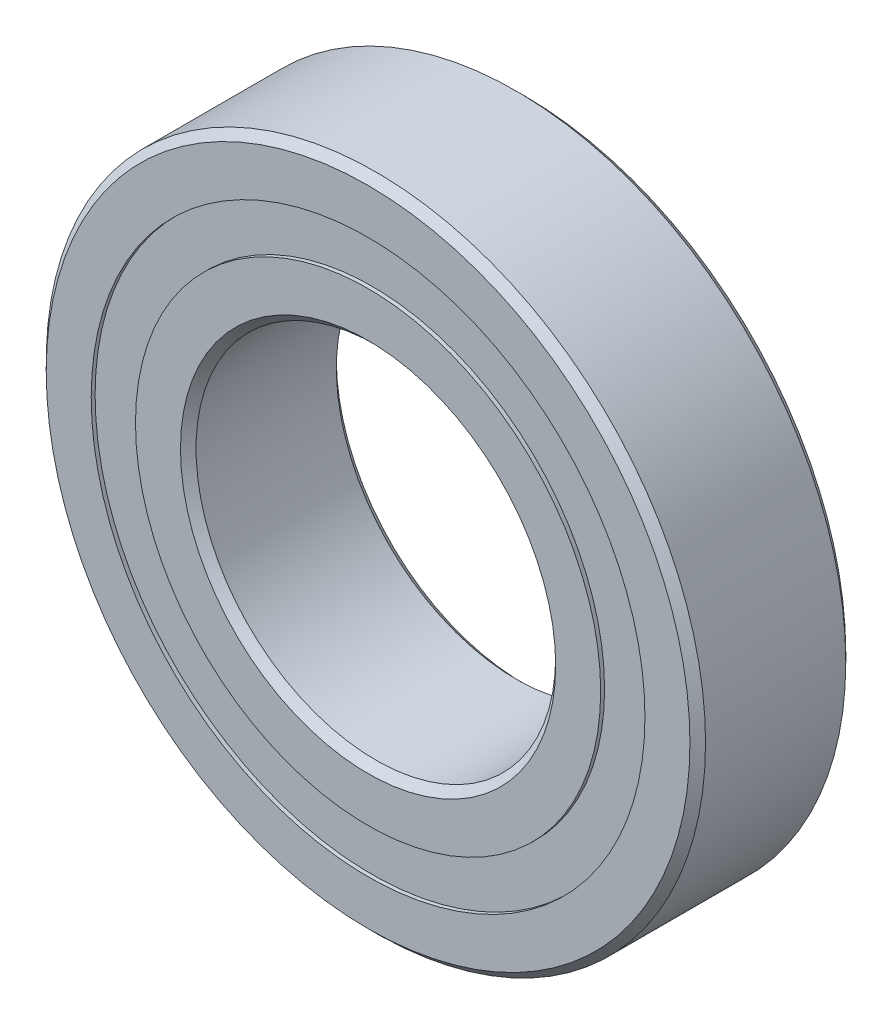
ISO-10303-21;
HEADER;
FILE_DESCRIPTION(('STEP AP214'),'2;1');
FILE_NAME('part.step','',(''),(''),'','','');
FILE_SCHEMA(('AUTOMOTIVE_DESIGN { 1 0 10303 214 1 1 1 1 }'));
ENDSEC;
DATA;
#1=APPLICATION_CONTEXT('core data for automotive mechanical design processes');
#2=APPLICATION_PROTOCOL_DEFINITION('international standard','automotive_design',2000,#1);
#3=PRODUCT_CONTEXT('',#1,'mechanical');
#4=PRODUCT('Part','Part','',(#3));
#5=PRODUCT_RELATED_PRODUCT_CATEGORY('part','',(#4));
#6=PRODUCT_DEFINITION_FORMATION('','',#4);
#7=PRODUCT_DEFINITION_CONTEXT('part definition',#1,'design');
#8=PRODUCT_DEFINITION('design','',#6,#7);
#9=PRODUCT_DEFINITION_SHAPE('','',#8);
#10=(LENGTH_UNIT() NAMED_UNIT(*) SI_UNIT(.MILLI.,.METRE.));
#11=(NAMED_UNIT(*) PLANE_ANGLE_UNIT() SI_UNIT($,.RADIAN.));
#12=(NAMED_UNIT(*) SI_UNIT($,.STERADIAN.) SOLID_ANGLE_UNIT());
#13=UNCERTAINTY_MEASURE_WITH_UNIT(LENGTH_MEASURE(1.E-05),#10,'distance_accuracy_value','');
#14=(GEOMETRIC_REPRESENTATION_CONTEXT(3) GLOBAL_UNCERTAINTY_ASSIGNED_CONTEXT((#13)) GLOBAL_UNIT_ASSIGNED_CONTEXT((#10,
#11,#12)) REPRESENTATION_CONTEXT('',''));
#15=CARTESIAN_POINT('',(0.,0.,0.));
#16=DIRECTION('',(0.,0.,1.));
#17=DIRECTION('',(1.,0.,0.));
#18=AXIS2_PLACEMENT_3D('',#15,#16,#17);
#19=CARTESIAN_POINT('',(0.,23.0961538461538,-6.175));
#20=DIRECTION('',(0.,0.,1.));
#21=DIRECTION('',(1.,0.,0.));
#22=AXIS2_PLACEMENT_3D('',#19,#20,#21);
#23=PLANE('',#22);
#24=CARTESIAN_POINT('',(0.,0.,-6.175));
#25=DIRECTION('',(0.,0.,1.));
#26=DIRECTION('',(1.,0.,0.));
#27=AXIS2_PLACEMENT_3D('',#24,#25,#26);
#28=CIRCLE('',#27,23.0961538461538);
#29=CARTESIAN_POINT('',(23.0961538461538,0.,-6.175));
#30=VERTEX_POINT('',#29);
#31=EDGE_CURVE('E57',#30,#30,#28,.T.);
#32=ORIENTED_EDGE('',*,*,#31,.F.);
#33=EDGE_LOOP('',(#32));
#34=FACE_BOUND('',#33,.T.);
#35=CARTESIAN_POINT('',(0.,0.,-6.175));
#36=DIRECTION('',(0.,0.,1.));
#37=DIRECTION('',(1.,0.,0.));
#38=AXIS2_PLACEMENT_3D('',#35,#36,#37);
#39=CIRCLE('',#38,19.4038461538462);
#40=CARTESIAN_POINT('',(19.4038461538462,0.,-6.175));
#41=VERTEX_POINT('',#40);
#42=EDGE_CURVE('E11',#41,#41,#39,.T.);
#43=ORIENTED_EDGE('',*,*,#42,.T.);
#44=EDGE_LOOP('',(#43));
#45=FACE_BOUND('',#44,.T.);
#46=ADVANCED_FACE('F43',(#34,#45),#23,.F.);
#47=CARTESIAN_POINT('',(0.,0.,6.5));
#48=DIRECTION('',(0.,0.,1.));
#49=DIRECTION('',(1.,0.,0.));
#50=AXIS2_PLACEMENT_3D('',#47,#48,#49);
#51=CYLINDRICAL_SURFACE('',#50,19.4038461538462);
#52=ORIENTED_EDGE('',*,*,#42,.F.);
#53=EDGE_LOOP('',(#52));
#54=FACE_BOUND('',#53,.T.);
#55=CARTESIAN_POINT('',(0.,0.,-3.42840531968061));
#56=DIRECTION('',(0.,0.,1.));
#57=DIRECTION('',(1.,0.,0.));
#58=AXIS2_PLACEMENT_3D('',#55,#56,#57);
#59=CIRCLE('',#58,19.4038461538462);
#60=CARTESIAN_POINT('',(19.4038461538462,0.,-3.42840531968061));
#61=VERTEX_POINT('',#60);
#62=EDGE_CURVE('E49',#61,#61,#59,.T.);
#63=ORIENTED_EDGE('',*,*,#62,.T.);
#64=EDGE_LOOP('',(#63));
#65=FACE_BOUND('',#64,.T.);
#66=ADVANCED_FACE('F66',(#54,#65),#51,.F.);
#67=CARTESIAN_POINT('',(0.,23.0961538461538,-3.42840531968061));
#68=DIRECTION('',(0.,0.,-1.));
#69=DIRECTION('',(-1.,0.,0.));
#70=AXIS2_PLACEMENT_3D('',#67,#68,#69);
#71=PLANE('',#70);
#72=ORIENTED_EDGE('',*,*,#62,.F.);
#73=EDGE_LOOP('',(#72));
#74=FACE_BOUND('',#73,.T.);
#75=CARTESIAN_POINT('',(0.,0.,-3.42840531968061));
#76=DIRECTION('',(0.,0.,1.));
#77=DIRECTION('',(1.,0.,0.));
#78=AXIS2_PLACEMENT_3D('',#75,#76,#77);
#79=CIRCLE('',#78,23.0961538461538);
#80=CARTESIAN_POINT('',(23.0961538461538,0.,-3.42840531968061));
#81=VERTEX_POINT('',#80);
#82=EDGE_CURVE('E53',#81,#81,#79,.T.);
#83=ORIENTED_EDGE('',*,*,#82,.T.);
#84=EDGE_LOOP('',(#83));
#85=FACE_BOUND('',#84,.T.);
#86=ADVANCED_FACE('F70',(#74,#85),#71,.F.);
#87=CARTESIAN_POINT('',(0.,0.,6.5));
#88=DIRECTION('',(0.,0.,1.));
#89=DIRECTION('',(1.,0.,0.));
#90=AXIS2_PLACEMENT_3D('',#87,#88,#89);
#91=CYLINDRICAL_SURFACE('',#90,23.0961538461538);
#92=ORIENTED_EDGE('',*,*,#82,.F.);
#93=EDGE_LOOP('',(#92));
#94=FACE_BOUND('',#93,.T.);
#95=ORIENTED_EDGE('',*,*,#31,.T.);
#96=EDGE_LOOP('',(#95));
#97=FACE_BOUND('',#96,.T.);
#98=ADVANCED_FACE('F63',(#94,#97),#91,.T.);
#99=CLOSED_SHELL('',(#46,#66,#86,#98));
#100=MANIFOLD_SOLID_BREP('B2',#99);
#101=CARTESIAN_POINT('',(0.,23.0961538461538,6.175));
#102=DIRECTION('',(0.,0.,-1.));
#103=DIRECTION('',(-1.,0.,0.));
#104=AXIS2_PLACEMENT_3D('',#101,#102,#103);
#105=PLANE('',#104);
#106=CARTESIAN_POINT('',(0.,0.,6.175));
#107=DIRECTION('',(0.,0.,1.));
#108=DIRECTION('',(1.,0.,0.));
#109=AXIS2_PLACEMENT_3D('',#106,#107,#108);
#110=CIRCLE('',#109,19.4038461538462);
#111=CARTESIAN_POINT('',(19.4038461538462,0.,6.175));
#112=VERTEX_POINT('',#111);
#113=EDGE_CURVE('E42',#112,#112,#110,.T.);
#114=ORIENTED_EDGE('',*,*,#113,.F.);
#115=EDGE_LOOP('',(#114));
#116=FACE_BOUND('',#115,.T.);
#117=CARTESIAN_POINT('',(0.,0.,6.175));
#118=DIRECTION('',(0.,0.,1.));
#119=DIRECTION('',(1.,0.,0.));
#120=AXIS2_PLACEMENT_3D('',#117,#118,#119);
#121=CIRCLE('',#120,23.0961538461538);
#122=CARTESIAN_POINT('',(23.0961538461538,0.,6.175));
#123=VERTEX_POINT('',#122);
#124=EDGE_CURVE('E124',#123,#123,#121,.T.);
#125=ORIENTED_EDGE('',*,*,#124,.T.);
#126=EDGE_LOOP('',(#125));
#127=FACE_BOUND('',#126,.T.);
#128=ADVANCED_FACE('F110',(#116,#127),#105,.F.);
#129=CARTESIAN_POINT('',(0.,0.,6.5));
#130=DIRECTION('',(0.,0.,1.));
#131=DIRECTION('',(1.,0.,0.));
#132=AXIS2_PLACEMENT_3D('',#129,#130,#131);
#133=CYLINDRICAL_SURFACE('',#132,19.4038461538462);
#134=CARTESIAN_POINT('',(0.,0.,3.42840531968061));
#135=DIRECTION('',(0.,0.,1.));
#136=DIRECTION('',(1.,0.,0.));
#137=AXIS2_PLACEMENT_3D('',#134,#135,#136);
#138=CIRCLE('',#137,19.4038461538462);
#139=CARTESIAN_POINT('',(19.4038461538462,0.,3.42840531968061));
#140=VERTEX_POINT('',#139);
#141=EDGE_CURVE('E116',#140,#140,#138,.T.);
#142=ORIENTED_EDGE('',*,*,#141,.F.);
#143=EDGE_LOOP('',(#142));
#144=FACE_BOUND('',#143,.T.);
#145=ORIENTED_EDGE('',*,*,#113,.T.);
#146=EDGE_LOOP('',(#145));
#147=FACE_BOUND('',#146,.T.);
#148=ADVANCED_FACE('F139',(#144,#147),#133,.F.);
#149=CARTESIAN_POINT('',(0.,23.0961538461538,3.42840531968061));
#150=DIRECTION('',(0.,0.,1.));
#151=DIRECTION('',(1.,0.,0.));
#152=AXIS2_PLACEMENT_3D('',#149,#150,#151);
#153=PLANE('',#152);
#154=CARTESIAN_POINT('',(0.,0.,3.42840531968061));
#155=DIRECTION('',(0.,0.,1.));
#156=DIRECTION('',(1.,0.,0.));
#157=AXIS2_PLACEMENT_3D('',#154,#155,#156);
#158=CIRCLE('',#157,23.0961538461538);
#159=CARTESIAN_POINT('',(23.0961538461538,0.,3.42840531968061));
#160=VERTEX_POINT('',#159);
#161=EDGE_CURVE('E120',#160,#160,#158,.T.);
#162=ORIENTED_EDGE('',*,*,#161,.F.);
#163=EDGE_LOOP('',(#162));
#164=FACE_BOUND('',#163,.T.);
#165=ORIENTED_EDGE('',*,*,#141,.T.);
#166=EDGE_LOOP('',(#165));
#167=FACE_BOUND('',#166,.T.);
#168=ADVANCED_FACE('F134',(#164,#167),#153,.F.);
#169=CARTESIAN_POINT('',(0.,0.,6.5));
#170=DIRECTION('',(0.,0.,1.));
#171=DIRECTION('',(1.,0.,0.));
#172=AXIS2_PLACEMENT_3D('',#169,#170,#171);
#173=CYLINDRICAL_SURFACE('',#172,23.0961538461538);
#174=ORIENTED_EDGE('',*,*,#124,.F.);
#175=EDGE_LOOP('',(#174));
#176=FACE_BOUND('',#175,.T.);
#177=ORIENTED_EDGE('',*,*,#161,.T.);
#178=EDGE_LOOP('',(#177));
#179=FACE_BOUND('',#178,.T.);
#180=ADVANCED_FACE('F131',(#176,#179),#173,.T.);
#181=CLOSED_SHELL('',(#128,#148,#168,#180));
#182=MANIFOLD_SOLID_BREP('B6',#181);
#183=CARTESIAN_POINT('',(-9.22002945624786,19.1455884429265,0.));
#184=DIRECTION('',(0.,0.,1.));
#185=DIRECTION('',(-0.433883739117546,0.900968867902425,0.));
#186=AXIS2_PLACEMENT_3D('',#183,#184,#185);
#187=SPHERICAL_SURFACE('',#186,3.42840531968061);
#188=CARTESIAN_POINT('',(-9.22002945624786,19.1455884429265,3.42840531968061));
#189=VERTEX_POINT('',#188);
#190=VERTEX_LOOP('',#189);
#191=FACE_BOUND('',#190,.T.);
#192=ADVANCED_FACE('F177',(#191),#187,.T.);
#193=CLOSED_SHELL('',(#192));
#194=MANIFOLD_SOLID_BREP('B37',#193);
#195=CARTESIAN_POINT('',(-16.6139190024455,13.2491582894983,0.));
#196=DIRECTION('',(0.,0.,1.));
#197=DIRECTION('',(-0.781831482468022,0.623489801858743,0.));
#198=AXIS2_PLACEMENT_3D('',#195,#196,#197);
#199=SPHERICAL_SURFACE('',#198,3.42840531968061);
#200=CARTESIAN_POINT('',(-16.6139190024455,13.2491582894983,3.42840531968061));
#201=VERTEX_POINT('',#200);
#202=VERTEX_LOOP('',#201);
#203=FACE_BOUND('',#202,.T.);
#204=ADVANCED_FACE('F197',(#203),#199,.T.);
#205=CLOSED_SHELL('',(#204));
#206=MANIFOLD_SOLID_BREP('B106',#205);
#207=CARTESIAN_POINT('',(-20.7172181338637,4.7285698465719,0.));
#208=DIRECTION('',(0.,0.,1.));
#209=DIRECTION('',(-0.974927912181821,0.222520933956325,0.));
#210=AXIS2_PLACEMENT_3D('',#207,#208,#209);
#211=SPHERICAL_SURFACE('',#210,3.42840531968061);
#212=CARTESIAN_POINT('',(-20.7172181338637,4.7285698465719,3.42840531968061));
#213=VERTEX_POINT('',#212);
#214=VERTEX_LOOP('',#213);
#215=FACE_BOUND('',#214,.T.);
#216=ADVANCED_FACE('F217',(#215),#211,.T.);
#217=CLOSED_SHELL('',(#216));
#218=MANIFOLD_SOLID_BREP('B173',#217);
#219=CARTESIAN_POINT('',(-20.7172181338638,-4.72856984657148,0.));
#220=DIRECTION('',(0.,0.,1.));
#221=DIRECTION('',(-0.974927912181826,-0.222520933956305,0.));
#222=AXIS2_PLACEMENT_3D('',#219,#220,#221);
#223=SPHERICAL_SURFACE('',#222,3.42840531968061);
#224=CARTESIAN_POINT('',(-20.7172181338638,-4.72856984657148,3.42840531968061));
#225=VERTEX_POINT('',#224);
#226=VERTEX_LOOP('',#225);
#227=FACE_BOUND('',#226,.T.);
#228=ADVANCED_FACE('F237',(#227),#223,.T.);
#229=CLOSED_SHELL('',(#228));
#230=MANIFOLD_SOLID_BREP('B193',#229);
#231=CARTESIAN_POINT('',(-16.6139190024457,-13.2491582894979,0.));
#232=DIRECTION('',(0.,0.,1.));
#233=DIRECTION('',(-0.781831482468035,-0.623489801858727,0.));
#234=AXIS2_PLACEMENT_3D('',#231,#232,#233);
#235=SPHERICAL_SURFACE('',#234,3.42840531968061);
#236=CARTESIAN_POINT('',(-16.6139190024457,-13.2491582894979,3.42840531968061));
#237=VERTEX_POINT('',#236);
#238=VERTEX_LOOP('',#237);
#239=FACE_BOUND('',#238,.T.);
#240=ADVANCED_FACE('F257',(#239),#235,.T.);
#241=CLOSED_SHELL('',(#240));
#242=MANIFOLD_SOLID_BREP('B213',#241);
#243=CARTESIAN_POINT('',(-9.22002945624826,-19.1455884429263,0.));
#244=DIRECTION('',(0.,0.,1.));
#245=DIRECTION('',(-0.433883739117565,-0.900968867902416,0.));
#246=AXIS2_PLACEMENT_3D('',#243,#244,#245);
#247=SPHERICAL_SURFACE('',#246,3.42840531968061);
#248=CARTESIAN_POINT('',(-9.22002945624826,-19.1455884429263,3.42840531968061));
#249=VERTEX_POINT('',#248);
#250=VERTEX_LOOP('',#249);
#251=FACE_BOUND('',#250,.T.);
#252=ADVANCED_FACE('F277',(#251),#247,.T.);
#253=CLOSED_SHELL('',(#252));
#254=MANIFOLD_SOLID_BREP('B233',#253);
#255=CARTESIAN_POINT('',(-1.48387956900833E-13,-21.25,0.));
#256=DIRECTION('',(0.,0.,1.));
#257=DIRECTION('',(0.,-1.,0.));
#258=AXIS2_PLACEMENT_3D('',#255,#256,#257);
#259=SPHERICAL_SURFACE('',#258,3.42840531968061);
#260=CARTESIAN_POINT('',(-1.48387956900833E-13,-21.25,3.42840531968061));
#261=VERTEX_POINT('',#260);
#262=VERTEX_LOOP('',#261);
#263=FACE_BOUND('',#262,.T.);
#264=ADVANCED_FACE('F297',(#263),#259,.T.);
#265=CLOSED_SHELL('',(#264));
#266=MANIFOLD_SOLID_BREP('B253',#265);
#267=CARTESIAN_POINT('',(9.22002945624799,-19.1455884429265,0.));
#268=DIRECTION('',(0.,0.,1.));
#269=DIRECTION('',(0.433883739117553,-0.900968867902422,0.));
#270=AXIS2_PLACEMENT_3D('',#267,#268,#269);
#271=SPHERICAL_SURFACE('',#270,3.42840531968061);
#272=CARTESIAN_POINT('',(9.22002945624799,-19.1455884429265,3.42840531968061));
#273=VERTEX_POINT('',#272);
#274=VERTEX_LOOP('',#273);
#275=FACE_BOUND('',#274,.T.);
#276=ADVANCED_FACE('F317',(#275),#271,.T.);
#277=CLOSED_SHELL('',(#276));
#278=MANIFOLD_SOLID_BREP('B273',#277);
#279=CARTESIAN_POINT('',(16.6139190024456,-13.2491582894982,0.));
#280=DIRECTION('',(0.,0.,1.));
#281=DIRECTION('',(0.781831482468027,-0.623489801858737,0.));
#282=AXIS2_PLACEMENT_3D('',#279,#280,#281);
#283=SPHERICAL_SURFACE('',#282,3.42840531968061);
#284=CARTESIAN_POINT('',(16.6139190024456,-13.2491582894982,3.42840531968061));
#285=VERTEX_POINT('',#284);
#286=VERTEX_LOOP('',#285);
#287=FACE_BOUND('',#286,.T.);
#288=ADVANCED_FACE('F337',(#287),#283,.T.);
#289=CLOSED_SHELL('',(#288));
#290=MANIFOLD_SOLID_BREP('B293',#289);
#291=CARTESIAN_POINT('',(20.7172181338637,-4.72856984657176,0.));
#292=DIRECTION('',(0.,0.,1.));
#293=DIRECTION('',(0.974927912181823,-0.222520933956318,0.));
#294=AXIS2_PLACEMENT_3D('',#291,#292,#293);
#295=SPHERICAL_SURFACE('',#294,3.42840531968061);
#296=CARTESIAN_POINT('',(20.7172181338637,-4.72856984657176,3.42840531968061));
#297=VERTEX_POINT('',#296);
#298=VERTEX_LOOP('',#297);
#299=FACE_BOUND('',#298,.T.);
#300=ADVANCED_FACE('F357',(#299),#295,.T.);
#301=CLOSED_SHELL('',(#300));
#302=MANIFOLD_SOLID_BREP('B313',#301);
#303=CARTESIAN_POINT('',(20.7172181338638,4.72856984657162,0.));
#304=DIRECTION('',(0.,0.,1.));
#305=DIRECTION('',(0.974927912181824,0.222520933956311,0.));
#306=AXIS2_PLACEMENT_3D('',#303,#304,#305);
#307=SPHERICAL_SURFACE('',#306,3.42840531968061);
#308=CARTESIAN_POINT('',(20.7172181338638,4.72856984657162,3.42840531968061));
#309=VERTEX_POINT('',#308);
#310=VERTEX_LOOP('',#309);
#311=FACE_BOUND('',#310,.T.);
#312=ADVANCED_FACE('F377',(#311),#307,.T.);
#313=CLOSED_SHELL('',(#312));
#314=MANIFOLD_SOLID_BREP('B333',#313);
#315=CARTESIAN_POINT('',(16.6139190024457,13.2491582894981,0.));
#316=DIRECTION('',(0.,0.,1.));
#317=DIRECTION('',(0.781831482468031,0.623489801858732,0.));
#318=AXIS2_PLACEMENT_3D('',#315,#316,#317);
#319=SPHERICAL_SURFACE('',#318,3.42840531968061);
#320=CARTESIAN_POINT('',(16.6139190024457,13.2491582894981,3.42840531968061));
#321=VERTEX_POINT('',#320);
#322=VERTEX_LOOP('',#321);
#323=FACE_BOUND('',#322,.T.);
#324=ADVANCED_FACE('F397',(#323),#319,.T.);
#325=CLOSED_SHELL('',(#324));
#326=MANIFOLD_SOLID_BREP('B353',#325);
#327=CARTESIAN_POINT('',(9.22002945624813,19.1455884429264,0.));
#328=DIRECTION('',(0.,0.,1.));
#329=DIRECTION('',(0.433883739117559,0.900968867902419,0.));
#330=AXIS2_PLACEMENT_3D('',#327,#328,#329);
#331=SPHERICAL_SURFACE('',#330,3.42840531968061);
#332=CARTESIAN_POINT('',(9.22002945624813,19.1455884429264,3.42840531968061));
#333=VERTEX_POINT('',#332);
#334=VERTEX_LOOP('',#333);
#335=FACE_BOUND('',#334,.T.);
#336=ADVANCED_FACE('F417',(#335),#331,.T.);
#337=CLOSED_SHELL('',(#336));
#338=MANIFOLD_SOLID_BREP('B373',#337);
#339=CARTESIAN_POINT('',(0.,21.25,0.));
#340=DIRECTION('',(0.,0.,1.));
#341=DIRECTION('',(0.,1.,0.));
#342=AXIS2_PLACEMENT_3D('',#339,#340,#341);
#343=SPHERICAL_SURFACE('',#342,3.42840531968061);
#344=CARTESIAN_POINT('',(0.,21.25,3.42840531968061));
#345=VERTEX_POINT('',#344);
#346=VERTEX_LOOP('',#345);
#347=FACE_BOUND('',#346,.T.);
#348=ADVANCED_FACE('F439',(#347),#343,.T.);
#349=CLOSED_SHELL('',(#348));
#350=MANIFOLD_SOLID_BREP('B393',#349);
#351=CARTESIAN_POINT('',(0.,19.4038461538462,6.5));
#352=DIRECTION('',(0.,0.,-1.));
#353=DIRECTION('',(-1.,0.,0.));
#354=AXIS2_PLACEMENT_3D('',#351,#352,#353);
#355=PLANE('',#354);
#356=CARTESIAN_POINT('',(0.,0.,6.5));
#357=DIRECTION('',(0.,0.,1.));
#358=DIRECTION('',(1.,0.,0.));
#359=AXIS2_PLACEMENT_3D('',#356,#357,#358);
#360=CIRCLE('',#359,15.65);
#361=CARTESIAN_POINT('',(15.65,0.,6.5));
#362=VERTEX_POINT('',#361);
#363=EDGE_CURVE('E486',#362,#362,#360,.T.);
#364=ORIENTED_EDGE('',*,*,#363,.F.);
#365=EDGE_LOOP('',(#364));
#366=FACE_BOUND('',#365,.T.);
#367=CARTESIAN_POINT('',(0.,0.,6.5));
#368=DIRECTION('',(0.,0.,1.));
#369=DIRECTION('',(1.,0.,0.));
#370=AXIS2_PLACEMENT_3D('',#367,#368,#369);
#371=CIRCLE('',#370,19.4038461538462);
#372=CARTESIAN_POINT('',(19.4038461538462,0.,6.5));
#373=VERTEX_POINT('',#372);
#374=EDGE_CURVE('E438',#373,#373,#371,.T.);
#375=ORIENTED_EDGE('',*,*,#374,.T.);
#376=EDGE_LOOP('',(#375));
#377=FACE_BOUND('',#376,.T.);
#378=ADVANCED_FACE('F458',(#366,#377),#355,.F.);
#379=CARTESIAN_POINT('',(0.,0.,6.5));
#380=DIRECTION('',(0.,0.,1.));
#381=DIRECTION('',(1.,0.,0.));
#382=AXIS2_PLACEMENT_3D('',#379,#380,#381);
#383=CYLINDRICAL_SURFACE('',#382,19.4038461538462);
#384=ORIENTED_EDGE('',*,*,#374,.F.);
#385=EDGE_LOOP('',(#384));
#386=FACE_BOUND('',#385,.T.);
#387=CARTESIAN_POINT('',(0.,0.,2.88888888888889));
#388=DIRECTION('',(0.,0.,1.));
#389=DIRECTION('',(1.,0.,0.));
#390=AXIS2_PLACEMENT_3D('',#387,#388,#389);
#391=CIRCLE('',#390,19.4038461538462);
#392=CARTESIAN_POINT('',(19.4038461538462,0.,2.88888888888889));
#393=VERTEX_POINT('',#392);
#394=EDGE_CURVE('E464',#393,#393,#391,.T.);
#395=ORIENTED_EDGE('',*,*,#394,.T.);
#396=EDGE_LOOP('',(#395));
#397=FACE_BOUND('',#396,.T.);
#398=ADVANCED_FACE('F493',(#386,#397),#383,.T.);
#399=CARTESIAN_POINT('',(0.,0.,0.));
#400=DIRECTION('',(0.,0.,1.));
#401=DIRECTION('',(1.,0.,0.));
#402=AXIS2_PLACEMENT_3D('',#399,#400,#401);
#403=TOROIDAL_SURFACE('',#402,21.25,3.4284053196806);
#404=ORIENTED_EDGE('',*,*,#394,.F.);
#405=EDGE_LOOP('',(#404));
#406=FACE_BOUND('',#405,.T.);
#407=CARTESIAN_POINT('',(0.,0.,-2.88888888888889));
#408=DIRECTION('',(0.,0.,1.));
#409=DIRECTION('',(1.,0.,0.));
#410=AXIS2_PLACEMENT_3D('',#407,#408,#409);
#411=CIRCLE('',#410,19.4038461538461);
#412=CARTESIAN_POINT('',(19.4038461538461,0.,-2.88888888888889));
#413=VERTEX_POINT('',#412);
#414=EDGE_CURVE('E468',#413,#413,#411,.T.);
#415=ORIENTED_EDGE('',*,*,#414,.T.);
#416=EDGE_LOOP('',(#415));
#417=FACE_BOUND('',#416,.T.);
#418=ADVANCED_FACE('F497',(#406,#417),#403,.F.);
#419=CARTESIAN_POINT('',(0.,0.,6.5));
#420=DIRECTION('',(0.,0.,1.));
#421=DIRECTION('',(1.,0.,0.));
#422=AXIS2_PLACEMENT_3D('',#419,#420,#421);
#423=CYLINDRICAL_SURFACE('',#422,19.4038461538462);
#424=ORIENTED_EDGE('',*,*,#414,.F.);
#425=EDGE_LOOP('',(#424));
#426=FACE_BOUND('',#425,.T.);
#427=CARTESIAN_POINT('',(0.,0.,-6.5));
#428=DIRECTION('',(0.,0.,1.));
#429=DIRECTION('',(1.,0.,0.));
#430=AXIS2_PLACEMENT_3D('',#427,#428,#429);
#431=CIRCLE('',#430,19.4038461538462);
#432=CARTESIAN_POINT('',(19.4038461538462,0.,-6.5));
#433=VERTEX_POINT('',#432);
#434=EDGE_CURVE('E472',#433,#433,#431,.T.);
#435=ORIENTED_EDGE('',*,*,#434,.T.);
#436=EDGE_LOOP('',(#435));
#437=FACE_BOUND('',#436,.T.);
#438=ADVANCED_FACE('F502',(#426,#437),#423,.T.);
#439=CARTESIAN_POINT('',(0.,15.65,-6.5));
#440=DIRECTION('',(0.,0.,1.));
#441=DIRECTION('',(1.,0.,0.));
#442=AXIS2_PLACEMENT_3D('',#439,#440,#441);
#443=PLANE('',#442);
#444=ORIENTED_EDGE('',*,*,#434,.F.);
#445=EDGE_LOOP('',(#444));
#446=FACE_BOUND('',#445,.T.);
#447=CARTESIAN_POINT('',(0.,0.,-6.5));
#448=DIRECTION('',(0.,0.,1.));
#449=DIRECTION('',(1.,0.,0.));
#450=AXIS2_PLACEMENT_3D('',#447,#448,#449);
#451=CIRCLE('',#450,15.65);
#452=CARTESIAN_POINT('',(15.65,0.,-6.5));
#453=VERTEX_POINT('',#452);
#454=EDGE_CURVE('E477',#453,#453,#451,.T.);
#455=ORIENTED_EDGE('',*,*,#454,.T.);
#456=EDGE_LOOP('',(#455));
#457=FACE_BOUND('',#456,.T.);
#458=ADVANCED_FACE('F508',(#446,#457),#443,.F.);
#459=CARTESIAN_POINT('',(0.,0.,-5.85));
#460=DIRECTION('',(0.,0.,-1.));
#461=DIRECTION('',(-1.,0.,0.));
#462=AXIS2_PLACEMENT_3D('',#459,#460,#461);
#463=CONICAL_SURFACE('',#462,15.,0.785398163397443);
#464=ORIENTED_EDGE('',*,*,#454,.F.);
#465=EDGE_LOOP('',(#464));
#466=FACE_BOUND('',#465,.T.);
#467=CARTESIAN_POINT('',(0.,0.,-5.85));
#468=DIRECTION('',(0.,0.,1.));
#469=DIRECTION('',(1.,0.,0.));
#470=AXIS2_PLACEMENT_3D('',#467,#468,#469);
#471=CIRCLE('',#470,15.);
#472=CARTESIAN_POINT('',(15.,0.,-5.85));
#473=VERTEX_POINT('',#472);
#474=EDGE_CURVE('E480',#473,#473,#471,.T.);
#475=ORIENTED_EDGE('',*,*,#474,.T.);
#476=EDGE_LOOP('',(#475));
#477=FACE_BOUND('',#476,.T.);
#478=ADVANCED_FACE('F512',(#466,#477),#463,.F.);
#479=CARTESIAN_POINT('',(0.,0.,6.5));
#480=DIRECTION('',(0.,0.,1.));
#481=DIRECTION('',(1.,0.,0.));
#482=AXIS2_PLACEMENT_3D('',#479,#480,#481);
#483=CYLINDRICAL_SURFACE('',#482,15.);
#484=ORIENTED_EDGE('',*,*,#474,.F.);
#485=EDGE_LOOP('',(#484));
#486=FACE_BOUND('',#485,.T.);
#487=CARTESIAN_POINT('',(0.,0.,5.85000000000001));
#488=DIRECTION('',(0.,0.,1.));
#489=DIRECTION('',(1.,0.,0.));
#490=AXIS2_PLACEMENT_3D('',#487,#488,#489);
#491=CIRCLE('',#490,15.);
#492=CARTESIAN_POINT('',(15.,0.,5.85000000000001));
#493=VERTEX_POINT('',#492);
#494=EDGE_CURVE('E483',#493,#493,#491,.T.);
#495=ORIENTED_EDGE('',*,*,#494,.T.);
#496=EDGE_LOOP('',(#495));
#497=FACE_BOUND('',#496,.T.);
#498=ADVANCED_FACE('F516',(#486,#497),#483,.F.);
#499=CARTESIAN_POINT('',(0.,0.,6.5));
#500=DIRECTION('',(0.,0.,1.));
#501=DIRECTION('',(1.,0.,0.));
#502=AXIS2_PLACEMENT_3D('',#499,#500,#501);
#503=CONICAL_SURFACE('',#502,15.65,0.785398163397454);
#504=ORIENTED_EDGE('',*,*,#494,.F.);
#505=EDGE_LOOP('',(#504));
#506=FACE_BOUND('',#505,.T.);
#507=ORIENTED_EDGE('',*,*,#363,.T.);
#508=EDGE_LOOP('',(#507));
#509=FACE_BOUND('',#508,.T.);
#510=ADVANCED_FACE('F490',(#506,#509),#503,.F.);
#511=CLOSED_SHELL('',(#378,#398,#418,#438,#458,#478,#498,#510));
#512=MANIFOLD_SOLID_BREP('B413',#511);
#513=CARTESIAN_POINT('',(0.,0.,5.85));
#514=DIRECTION('',(0.,0.,-1.));
#515=DIRECTION('',(-1.,0.,0.));
#516=AXIS2_PLACEMENT_3D('',#513,#514,#515);
#517=CONICAL_SURFACE('',#516,27.5,0.785398163397447);
#518=CARTESIAN_POINT('',(0.,0.,6.5));
#519=DIRECTION('',(0.,0.,1.));
#520=DIRECTION('',(1.,0.,0.));
#521=AXIS2_PLACEMENT_3D('',#518,#519,#520);
#522=CIRCLE('',#521,26.85);
#523=CARTESIAN_POINT('',(26.85,0.,6.5));
#524=VERTEX_POINT('',#523);
#525=EDGE_CURVE('E607',#524,#524,#522,.T.);
#526=ORIENTED_EDGE('',*,*,#525,.F.);
#527=EDGE_LOOP('',(#526));
#528=FACE_BOUND('',#527,.T.);
#529=CARTESIAN_POINT('',(0.,0.,5.85));
#530=DIRECTION('',(0.,0.,1.));
#531=DIRECTION('',(1.,0.,0.));
#532=AXIS2_PLACEMENT_3D('',#529,#530,#531);
#533=CIRCLE('',#532,27.5);
#534=CARTESIAN_POINT('',(27.5,0.,5.85));
#535=VERTEX_POINT('',#534);
#536=EDGE_CURVE('E457',#535,#535,#533,.T.);
#537=ORIENTED_EDGE('',*,*,#536,.T.);
#538=EDGE_LOOP('',(#537));
#539=FACE_BOUND('',#538,.T.);
#540=ADVANCED_FACE('F579',(#528,#539),#517,.T.);
#541=CARTESIAN_POINT('',(0.,0.,6.5));
#542=DIRECTION('',(0.,0.,1.));
#543=DIRECTION('',(1.,0.,0.));
#544=AXIS2_PLACEMENT_3D('',#541,#542,#543);
#545=CYLINDRICAL_SURFACE('',#544,27.5);
#546=ORIENTED_EDGE('',*,*,#536,.F.);
#547=EDGE_LOOP('',(#546));
#548=FACE_BOUND('',#547,.T.);
#549=CARTESIAN_POINT('',(0.,0.,-5.85));
#550=DIRECTION('',(0.,0.,1.));
#551=DIRECTION('',(1.,0.,0.));
#552=AXIS2_PLACEMENT_3D('',#549,#550,#551);
#553=CIRCLE('',#552,27.5);
#554=CARTESIAN_POINT('',(27.5,0.,-5.85));
#555=VERTEX_POINT('',#554);
#556=EDGE_CURVE('E585',#555,#555,#553,.T.);
#557=ORIENTED_EDGE('',*,*,#556,.T.);
#558=EDGE_LOOP('',(#557));
#559=FACE_BOUND('',#558,.T.);
#560=ADVANCED_FACE('F614',(#548,#559),#545,.T.);
#561=CARTESIAN_POINT('',(0.,0.,-6.5));
#562=DIRECTION('',(0.,0.,1.));
#563=DIRECTION('',(1.,0.,0.));
#564=AXIS2_PLACEMENT_3D('',#561,#562,#563);
#565=CONICAL_SURFACE('',#564,26.85,0.785398163397446);
#566=ORIENTED_EDGE('',*,*,#556,.F.);
#567=EDGE_LOOP('',(#566));
#568=FACE_BOUND('',#567,.T.);
#569=CARTESIAN_POINT('',(0.,0.,-6.5));
#570=DIRECTION('',(0.,0.,1.));
#571=DIRECTION('',(1.,0.,0.));
#572=AXIS2_PLACEMENT_3D('',#569,#570,#571);
#573=CIRCLE('',#572,26.85);
#574=CARTESIAN_POINT('',(26.85,0.,-6.5));
#575=VERTEX_POINT('',#574);
#576=EDGE_CURVE('E589',#575,#575,#573,.T.);
#577=ORIENTED_EDGE('',*,*,#576,.T.);
#578=EDGE_LOOP('',(#577));
#579=FACE_BOUND('',#578,.T.);
#580=ADVANCED_FACE('F618',(#568,#579),#565,.T.);
#581=CARTESIAN_POINT('',(0.,26.85,-6.5));
#582=DIRECTION('',(0.,0.,1.));
#583=DIRECTION('',(1.,0.,0.));
#584=AXIS2_PLACEMENT_3D('',#581,#582,#583);
#585=PLANE('',#584);
#586=ORIENTED_EDGE('',*,*,#576,.F.);
#587=EDGE_LOOP('',(#586));
#588=FACE_BOUND('',#587,.T.);
#589=CARTESIAN_POINT('',(0.,0.,-6.5));
#590=DIRECTION('',(0.,0.,1.));
#591=DIRECTION('',(1.,0.,0.));
#592=AXIS2_PLACEMENT_3D('',#589,#590,#591);
#593=CIRCLE('',#592,23.0961538461538);
#594=CARTESIAN_POINT('',(23.0961538461538,0.,-6.5));
#595=VERTEX_POINT('',#594);
#596=EDGE_CURVE('E593',#595,#595,#593,.T.);
#597=ORIENTED_EDGE('',*,*,#596,.T.);
#598=EDGE_LOOP('',(#597));
#599=FACE_BOUND('',#598,.T.);
#600=ADVANCED_FACE('F623',(#588,#599),#585,.F.);
#601=CARTESIAN_POINT('',(0.,0.,6.5));
#602=DIRECTION('',(0.,0.,1.));
#603=DIRECTION('',(1.,0.,0.));
#604=AXIS2_PLACEMENT_3D('',#601,#602,#603);
#605=CYLINDRICAL_SURFACE('',#604,23.0961538461538);
#606=ORIENTED_EDGE('',*,*,#596,.F.);
#607=EDGE_LOOP('',(#606));
#608=FACE_BOUND('',#607,.T.);
#609=CARTESIAN_POINT('',(0.,0.,-2.88888888888889));
#610=DIRECTION('',(0.,0.,1.));
#611=DIRECTION('',(1.,0.,0.));
#612=AXIS2_PLACEMENT_3D('',#609,#610,#611);
#613=CIRCLE('',#612,23.0961538461538);
#614=CARTESIAN_POINT('',(23.0961538461538,0.,-2.88888888888889));
#615=VERTEX_POINT('',#614);
#616=EDGE_CURVE('E598',#615,#615,#613,.T.);
#617=ORIENTED_EDGE('',*,*,#616,.T.);
#618=EDGE_LOOP('',(#617));
#619=FACE_BOUND('',#618,.T.);
#620=ADVANCED_FACE('F629',(#608,#619),#605,.F.);
#621=CARTESIAN_POINT('',(0.,0.,0.));
#622=DIRECTION('',(0.,0.,1.));
#623=DIRECTION('',(1.,0.,0.));
#624=AXIS2_PLACEMENT_3D('',#621,#622,#623);
#625=TOROIDAL_SURFACE('',#624,21.25,3.42840531968061);
#626=ORIENTED_EDGE('',*,*,#616,.F.);
#627=EDGE_LOOP('',(#626));
#628=FACE_BOUND('',#627,.T.);
#629=CARTESIAN_POINT('',(0.,0.,2.88888888888889));
#630=DIRECTION('',(0.,0.,1.));
#631=DIRECTION('',(1.,0.,0.));
#632=AXIS2_PLACEMENT_3D('',#629,#630,#631);
#633=CIRCLE('',#632,23.0961538461538);
#634=CARTESIAN_POINT('',(23.0961538461538,0.,2.88888888888889));
#635=VERTEX_POINT('',#634);
#636=EDGE_CURVE('E601',#635,#635,#633,.T.);
#637=ORIENTED_EDGE('',*,*,#636,.T.);
#638=EDGE_LOOP('',(#637));
#639=FACE_BOUND('',#638,.T.);
#640=ADVANCED_FACE('F633',(#628,#639),#625,.F.);
#641=CARTESIAN_POINT('',(0.,0.,6.5));
#642=DIRECTION('',(0.,0.,1.));
#643=DIRECTION('',(1.,0.,0.));
#644=AXIS2_PLACEMENT_3D('',#641,#642,#643);
#645=CYLINDRICAL_SURFACE('',#644,23.0961538461538);
#646=ORIENTED_EDGE('',*,*,#636,.F.);
#647=EDGE_LOOP('',(#646));
#648=FACE_BOUND('',#647,.T.);
#649=CARTESIAN_POINT('',(0.,0.,6.5));
#650=DIRECTION('',(0.,0.,1.));
#651=DIRECTION('',(1.,0.,0.));
#652=AXIS2_PLACEMENT_3D('',#649,#650,#651);
#653=CIRCLE('',#652,23.0961538461538);
#654=CARTESIAN_POINT('',(23.0961538461538,0.,6.5));
#655=VERTEX_POINT('',#654);
#656=EDGE_CURVE('E604',#655,#655,#653,.T.);
#657=ORIENTED_EDGE('',*,*,#656,.T.);
#658=EDGE_LOOP('',(#657));
#659=FACE_BOUND('',#658,.T.);
#660=ADVANCED_FACE('F637',(#648,#659),#645,.F.);
#661=CARTESIAN_POINT('',(0.,26.85,6.5));
#662=DIRECTION('',(0.,0.,-1.));
#663=DIRECTION('',(-1.,0.,0.));
#664=AXIS2_PLACEMENT_3D('',#661,#662,#663);
#665=PLANE('',#664);
#666=ORIENTED_EDGE('',*,*,#656,.F.);
#667=EDGE_LOOP('',(#666));
#668=FACE_BOUND('',#667,.T.);
#669=ORIENTED_EDGE('',*,*,#525,.T.);
#670=EDGE_LOOP('',(#669));
#671=FACE_BOUND('',#670,.T.);
#672=ADVANCED_FACE('F611',(#668,#671),#665,.F.);
#673=CLOSED_SHELL('',(#540,#560,#580,#600,#620,#640,#660,#672));
#674=MANIFOLD_SOLID_BREP('B433',#673);
#675=ADVANCED_BREP_SHAPE_REPRESENTATION('',(#18,#100,#182,#194,#206,#218,#230,#242,#254,#266,
#278,#290,#302,#314,#326,#338,#350,#512,#674),#14);
#676=SHAPE_DEFINITION_REPRESENTATION(#9,#675);
ENDSEC;
END-ISO-10303-21;
